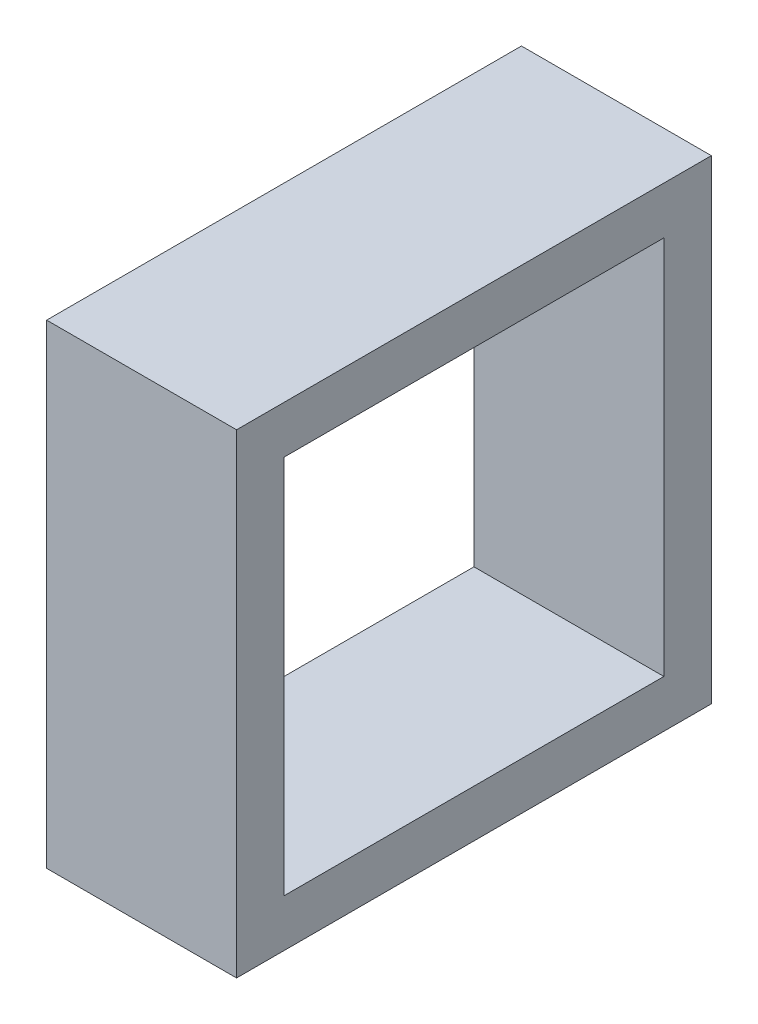
ISO-10303-21;
HEADER;
FILE_DESCRIPTION(('STEP AP214'),'2;1');
FILE_NAME('part.step','',(''),(''),'','','');
FILE_SCHEMA(('AUTOMOTIVE_DESIGN { 1 0 10303 214 1 1 1 1 }'));
ENDSEC;
DATA;
#1=APPLICATION_CONTEXT('core data for automotive mechanical design processes');
#2=APPLICATION_PROTOCOL_DEFINITION('international standard','automotive_design',2000,#1);
#3=PRODUCT_CONTEXT('',#1,'mechanical');
#4=PRODUCT('Part','Part','',(#3));
#5=PRODUCT_RELATED_PRODUCT_CATEGORY('part','',(#4));
#6=PRODUCT_DEFINITION_FORMATION('','',#4);
#7=PRODUCT_DEFINITION_CONTEXT('part definition',#1,'design');
#8=PRODUCT_DEFINITION('design','',#6,#7);
#9=PRODUCT_DEFINITION_SHAPE('','',#8);
#10=(LENGTH_UNIT() NAMED_UNIT(*) SI_UNIT(.MILLI.,.METRE.));
#11=(NAMED_UNIT(*) PLANE_ANGLE_UNIT() SI_UNIT($,.RADIAN.));
#12=(NAMED_UNIT(*) SI_UNIT($,.STERADIAN.) SOLID_ANGLE_UNIT());
#13=UNCERTAINTY_MEASURE_WITH_UNIT(LENGTH_MEASURE(1.E-05),#10,'distance_accuracy_value','');
#14=(GEOMETRIC_REPRESENTATION_CONTEXT(3) GLOBAL_UNCERTAINTY_ASSIGNED_CONTEXT((#13)) GLOBAL_UNIT_ASSIGNED_CONTEXT((#10,
#11,#12)) REPRESENTATION_CONTEXT('',''));
#15=CARTESIAN_POINT('',(0.,0.,0.));
#16=DIRECTION('',(0.,0.,1.));
#17=DIRECTION('',(1.,0.,0.));
#18=AXIS2_PLACEMENT_3D('',#15,#16,#17);
#19=CARTESIAN_POINT('',(10.,0.,0.));
#20=DIRECTION('',(-1.,0.,0.));
#21=DIRECTION('',(0.,0.,1.));
#22=AXIS2_PLACEMENT_3D('',#19,#20,#21);
#23=PLANE('',#22);
#24=DIRECTION('',(0.,1.,0.));
#25=VECTOR('',#24,1.);
#26=CARTESIAN_POINT('',(10.,-12.5,-12.5));
#27=LINE('',#26,#25);
#28=CARTESIAN_POINT('',(10.,-12.5,-12.5));
#29=VERTEX_POINT('',#28);
#30=CARTESIAN_POINT('',(10.,12.5,-12.5));
#31=VERTEX_POINT('',#30);
#32=EDGE_CURVE('E157',#29,#31,#27,.T.);
#33=ORIENTED_EDGE('',*,*,#32,.T.);
#34=DIRECTION('',(0.,0.,1.));
#35=VECTOR('',#34,1.);
#36=CARTESIAN_POINT('',(10.,12.5,12.5));
#37=LINE('',#36,#35);
#38=CARTESIAN_POINT('',(10.,12.5,12.5));
#39=VERTEX_POINT('',#38);
#40=EDGE_CURVE('E161',#31,#39,#37,.T.);
#41=ORIENTED_EDGE('',*,*,#40,.T.);
#42=DIRECTION('',(0.,-1.,0.));
#43=VECTOR('',#42,1.);
#44=CARTESIAN_POINT('',(10.,-12.5,12.5));
#45=LINE('',#44,#43);
#46=CARTESIAN_POINT('',(10.,-12.5,12.5));
#47=VERTEX_POINT('',#46);
#48=EDGE_CURVE('E165',#39,#47,#45,.T.);
#49=ORIENTED_EDGE('',*,*,#48,.T.);
#50=DIRECTION('',(0.,0.,-1.));
#51=VECTOR('',#50,1.);
#52=CARTESIAN_POINT('',(10.,-12.5,12.5));
#53=LINE('',#52,#51);
#54=EDGE_CURVE('E168',#47,#29,#53,.T.);
#55=ORIENTED_EDGE('',*,*,#54,.T.);
#56=EDGE_LOOP('',(#33,#41,#49,#55));
#57=FACE_BOUND('',#56,.T.);
#58=DIRECTION('',(0.,1.,0.));
#59=VECTOR('',#58,1.);
#60=CARTESIAN_POINT('',(10.,-10.,-10.));
#61=LINE('',#60,#59);
#62=CARTESIAN_POINT('',(10.,-10.,-10.));
#63=VERTEX_POINT('',#62);
#64=CARTESIAN_POINT('',(10.,10.,-10.));
#65=VERTEX_POINT('',#64);
#66=EDGE_CURVE('E109',#63,#65,#61,.T.);
#67=ORIENTED_EDGE('',*,*,#66,.F.);
#68=DIRECTION('',(0.,0.,-1.));
#69=VECTOR('',#68,1.);
#70=CARTESIAN_POINT('',(10.,-10.,10.));
#71=LINE('',#70,#69);
#72=CARTESIAN_POINT('',(10.,-10.,10.));
#73=VERTEX_POINT('',#72);
#74=EDGE_CURVE('E135',#73,#63,#71,.T.);
#75=ORIENTED_EDGE('',*,*,#74,.F.);
#76=DIRECTION('',(0.,-1.,0.));
#77=VECTOR('',#76,1.);
#78=CARTESIAN_POINT('',(10.,-10.,10.));
#79=LINE('',#78,#77);
#80=CARTESIAN_POINT('',(10.,10.,10.));
#81=VERTEX_POINT('',#80);
#82=EDGE_CURVE('E131',#81,#73,#79,.T.);
#83=ORIENTED_EDGE('',*,*,#82,.F.);
#84=DIRECTION('',(0.,0.,1.));
#85=VECTOR('',#84,1.);
#86=CARTESIAN_POINT('',(10.,10.,10.));
#87=LINE('',#86,#85);
#88=EDGE_CURVE('E118',#65,#81,#87,.T.);
#89=ORIENTED_EDGE('',*,*,#88,.F.);
#90=EDGE_LOOP('',(#67,#75,#83,#89));
#91=FACE_BOUND('',#90,.T.);
#92=ADVANCED_FACE('F43',(#57,#91),#23,.F.);
#93=CARTESIAN_POINT('',(0.,0.,0.));
#94=DIRECTION('',(-1.,0.,0.));
#95=DIRECTION('',(0.,0.,1.));
#96=AXIS2_PLACEMENT_3D('',#93,#94,#95);
#97=PLANE('',#96);
#98=DIRECTION('',(0.,1.,0.));
#99=VECTOR('',#98,1.);
#100=CARTESIAN_POINT('',(0.,-12.5,-12.5));
#101=LINE('',#100,#99);
#102=CARTESIAN_POINT('',(0.,-12.5,-12.5));
#103=VERTEX_POINT('',#102);
#104=CARTESIAN_POINT('',(0.,12.5,-12.5));
#105=VERTEX_POINT('',#104);
#106=EDGE_CURVE('E127',#103,#105,#101,.T.);
#107=ORIENTED_EDGE('',*,*,#106,.F.);
#108=DIRECTION('',(0.,0.,-1.));
#109=VECTOR('',#108,1.);
#110=CARTESIAN_POINT('',(0.,-12.5,12.5));
#111=LINE('',#110,#109);
#112=CARTESIAN_POINT('',(0.,-12.5,12.5));
#113=VERTEX_POINT('',#112);
#114=EDGE_CURVE('E162',#113,#103,#111,.T.);
#115=ORIENTED_EDGE('',*,*,#114,.F.);
#116=DIRECTION('',(0.,-1.,0.));
#117=VECTOR('',#116,1.);
#118=CARTESIAN_POINT('',(0.,-12.5,12.5));
#119=LINE('',#118,#117);
#120=CARTESIAN_POINT('',(0.,12.5,12.5));
#121=VERTEX_POINT('',#120);
#122=EDGE_CURVE('E178',#121,#113,#119,.T.);
#123=ORIENTED_EDGE('',*,*,#122,.F.);
#124=DIRECTION('',(0.,0.,1.));
#125=VECTOR('',#124,1.);
#126=CARTESIAN_POINT('',(0.,12.5,12.5));
#127=LINE('',#126,#125);
#128=EDGE_CURVE('E175',#105,#121,#127,.T.);
#129=ORIENTED_EDGE('',*,*,#128,.F.);
#130=EDGE_LOOP('',(#107,#115,#123,#129));
#131=FACE_BOUND('',#130,.T.);
#132=DIRECTION('',(0.,0.,-1.));
#133=VECTOR('',#132,1.);
#134=CARTESIAN_POINT('',(0.,-10.,10.));
#135=LINE('',#134,#133);
#136=CARTESIAN_POINT('',(0.,-10.,10.));
#137=VERTEX_POINT('',#136);
#138=CARTESIAN_POINT('',(0.,-10.,-10.));
#139=VERTEX_POINT('',#138);
#140=EDGE_CURVE('E119',#137,#139,#135,.T.);
#141=ORIENTED_EDGE('',*,*,#140,.T.);
#142=DIRECTION('',(0.,1.,0.));
#143=VECTOR('',#142,1.);
#144=CARTESIAN_POINT('',(0.,-10.,-10.));
#145=LINE('',#144,#143);
#146=CARTESIAN_POINT('',(0.,10.,-10.));
#147=VERTEX_POINT('',#146);
#148=EDGE_CURVE('E67',#139,#147,#145,.T.);
#149=ORIENTED_EDGE('',*,*,#148,.T.);
#150=DIRECTION('',(0.,0.,1.));
#151=VECTOR('',#150,1.);
#152=CARTESIAN_POINT('',(0.,10.,10.));
#153=LINE('',#152,#151);
#154=CARTESIAN_POINT('',(0.,10.,10.));
#155=VERTEX_POINT('',#154);
#156=EDGE_CURVE('E125',#147,#155,#153,.T.);
#157=ORIENTED_EDGE('',*,*,#156,.T.);
#158=DIRECTION('',(0.,-1.,0.));
#159=VECTOR('',#158,1.);
#160=CARTESIAN_POINT('',(0.,-10.,10.));
#161=LINE('',#160,#159);
#162=EDGE_CURVE('E144',#155,#137,#161,.T.);
#163=ORIENTED_EDGE('',*,*,#162,.T.);
#164=EDGE_LOOP('',(#141,#149,#157,#163));
#165=FACE_BOUND('',#164,.T.);
#166=ADVANCED_FACE('F201',(#131,#165),#97,.T.);
#167=CARTESIAN_POINT('',(10.,-12.5,-12.5));
#168=DIRECTION('',(0.,0.,1.));
#169=DIRECTION('',(1.,0.,0.));
#170=AXIS2_PLACEMENT_3D('',#167,#168,#169);
#171=PLANE('',#170);
#172=ORIENTED_EDGE('',*,*,#106,.T.);
#173=DIRECTION('',(-1.,0.,0.));
#174=VECTOR('',#173,1.);
#175=CARTESIAN_POINT('',(10.,12.5,-12.5));
#176=LINE('',#175,#174);
#177=EDGE_CURVE('E11',#31,#105,#176,.T.);
#178=ORIENTED_EDGE('',*,*,#177,.F.);
#179=ORIENTED_EDGE('',*,*,#32,.F.);
#180=DIRECTION('',(-1.,0.,0.));
#181=VECTOR('',#180,1.);
#182=CARTESIAN_POINT('',(10.,-12.5,-12.5));
#183=LINE('',#182,#181);
#184=EDGE_CURVE('E171',#29,#103,#183,.T.);
#185=ORIENTED_EDGE('',*,*,#184,.T.);
#186=EDGE_LOOP('',(#172,#178,#179,#185));
#187=FACE_BOUND('',#186,.T.);
#188=ADVANCED_FACE('F45',(#187),#171,.F.);
#189=CARTESIAN_POINT('',(10.,12.5,12.5));
#190=DIRECTION('',(0.,-1.,0.));
#191=DIRECTION('',(0.,0.,-1.));
#192=AXIS2_PLACEMENT_3D('',#189,#190,#191);
#193=PLANE('',#192);
#194=ORIENTED_EDGE('',*,*,#128,.T.);
#195=DIRECTION('',(-1.,0.,0.));
#196=VECTOR('',#195,1.);
#197=CARTESIAN_POINT('',(10.,12.5,12.5));
#198=LINE('',#197,#196);
#199=EDGE_CURVE('E52',#39,#121,#198,.T.);
#200=ORIENTED_EDGE('',*,*,#199,.F.);
#201=ORIENTED_EDGE('',*,*,#40,.F.);
#202=ORIENTED_EDGE('',*,*,#177,.T.);
#203=EDGE_LOOP('',(#194,#200,#201,#202));
#204=FACE_BOUND('',#203,.T.);
#205=ADVANCED_FACE('F211',(#204),#193,.F.);
#206=CARTESIAN_POINT('',(10.,-12.5,12.5));
#207=DIRECTION('',(0.,0.,-1.));
#208=DIRECTION('',(-1.,0.,0.));
#209=AXIS2_PLACEMENT_3D('',#206,#207,#208);
#210=PLANE('',#209);
#211=ORIENTED_EDGE('',*,*,#122,.T.);
#212=DIRECTION('',(-1.,0.,0.));
#213=VECTOR('',#212,1.);
#214=CARTESIAN_POINT('',(10.,-12.5,12.5));
#215=LINE('',#214,#213);
#216=EDGE_CURVE('E186',#47,#113,#215,.T.);
#217=ORIENTED_EDGE('',*,*,#216,.F.);
#218=ORIENTED_EDGE('',*,*,#48,.F.);
#219=ORIENTED_EDGE('',*,*,#199,.T.);
#220=EDGE_LOOP('',(#211,#217,#218,#219));
#221=FACE_BOUND('',#220,.T.);
#222=ADVANCED_FACE('F195',(#221),#210,.F.);
#223=CARTESIAN_POINT('',(10.,-12.5,12.5));
#224=DIRECTION('',(0.,1.,0.));
#225=DIRECTION('',(0.,0.,1.));
#226=AXIS2_PLACEMENT_3D('',#223,#224,#225);
#227=PLANE('',#226);
#228=ORIENTED_EDGE('',*,*,#114,.T.);
#229=ORIENTED_EDGE('',*,*,#184,.F.);
#230=ORIENTED_EDGE('',*,*,#54,.F.);
#231=ORIENTED_EDGE('',*,*,#216,.T.);
#232=EDGE_LOOP('',(#228,#229,#230,#231));
#233=FACE_BOUND('',#232,.T.);
#234=ADVANCED_FACE('F205',(#233),#227,.F.);
#235=CARTESIAN_POINT('',(10.,-10.,-10.));
#236=DIRECTION('',(0.,0.,1.));
#237=DIRECTION('',(1.,0.,0.));
#238=AXIS2_PLACEMENT_3D('',#235,#236,#237);
#239=PLANE('',#238);
#240=ORIENTED_EDGE('',*,*,#148,.F.);
#241=DIRECTION('',(-1.,0.,0.));
#242=VECTOR('',#241,1.);
#243=CARTESIAN_POINT('',(10.,-10.,-10.));
#244=LINE('',#243,#242);
#245=EDGE_CURVE('E113',#63,#139,#244,.T.);
#246=ORIENTED_EDGE('',*,*,#245,.F.);
#247=ORIENTED_EDGE('',*,*,#66,.T.);
#248=DIRECTION('',(-1.,0.,0.));
#249=VECTOR('',#248,1.);
#250=CARTESIAN_POINT('',(10.,10.,-10.));
#251=LINE('',#250,#249);
#252=EDGE_CURVE('E112',#65,#147,#251,.T.);
#253=ORIENTED_EDGE('',*,*,#252,.T.);
#254=EDGE_LOOP('',(#240,#246,#247,#253));
#255=FACE_BOUND('',#254,.T.);
#256=ADVANCED_FACE('F111',(#255),#239,.T.);
#257=CARTESIAN_POINT('',(10.,10.,10.));
#258=DIRECTION('',(0.,-1.,0.));
#259=DIRECTION('',(0.,0.,-1.));
#260=AXIS2_PLACEMENT_3D('',#257,#258,#259);
#261=PLANE('',#260);
#262=ORIENTED_EDGE('',*,*,#156,.F.);
#263=ORIENTED_EDGE('',*,*,#252,.F.);
#264=ORIENTED_EDGE('',*,*,#88,.T.);
#265=DIRECTION('',(-1.,0.,0.));
#266=VECTOR('',#265,1.);
#267=CARTESIAN_POINT('',(10.,10.,10.));
#268=LINE('',#267,#266);
#269=EDGE_CURVE('E128',#81,#155,#268,.T.);
#270=ORIENTED_EDGE('',*,*,#269,.T.);
#271=EDGE_LOOP('',(#262,#263,#264,#270));
#272=FACE_BOUND('',#271,.T.);
#273=ADVANCED_FACE('F122',(#272),#261,.T.);
#274=CARTESIAN_POINT('',(10.,-10.,10.));
#275=DIRECTION('',(0.,0.,-1.));
#276=DIRECTION('',(-1.,0.,0.));
#277=AXIS2_PLACEMENT_3D('',#274,#275,#276);
#278=PLANE('',#277);
#279=ORIENTED_EDGE('',*,*,#162,.F.);
#280=ORIENTED_EDGE('',*,*,#269,.F.);
#281=ORIENTED_EDGE('',*,*,#82,.T.);
#282=DIRECTION('',(-1.,0.,0.));
#283=VECTOR('',#282,1.);
#284=CARTESIAN_POINT('',(10.,-10.,10.));
#285=LINE('',#284,#283);
#286=EDGE_CURVE('E59',#73,#137,#285,.T.);
#287=ORIENTED_EDGE('',*,*,#286,.T.);
#288=EDGE_LOOP('',(#279,#280,#281,#287));
#289=FACE_BOUND('',#288,.T.);
#290=ADVANCED_FACE('F234',(#289),#278,.T.);
#291=CARTESIAN_POINT('',(10.,-10.,10.));
#292=DIRECTION('',(0.,1.,0.));
#293=DIRECTION('',(0.,0.,1.));
#294=AXIS2_PLACEMENT_3D('',#291,#292,#293);
#295=PLANE('',#294);
#296=ORIENTED_EDGE('',*,*,#140,.F.);
#297=ORIENTED_EDGE('',*,*,#286,.F.);
#298=ORIENTED_EDGE('',*,*,#74,.T.);
#299=ORIENTED_EDGE('',*,*,#245,.T.);
#300=EDGE_LOOP('',(#296,#297,#298,#299));
#301=FACE_BOUND('',#300,.T.);
#302=ADVANCED_FACE('F238',(#301),#295,.T.);
#303=CLOSED_SHELL('',(#92,#166,#188,#205,#222,#234,#256,#273,#290,#302));
#304=MANIFOLD_SOLID_BREP('B2',#303);
#305=ADVANCED_BREP_SHAPE_REPRESENTATION('',(#18,#304),#14);
#306=SHAPE_DEFINITION_REPRESENTATION(#9,#305);
ENDSEC;
END-ISO-10303-21;
